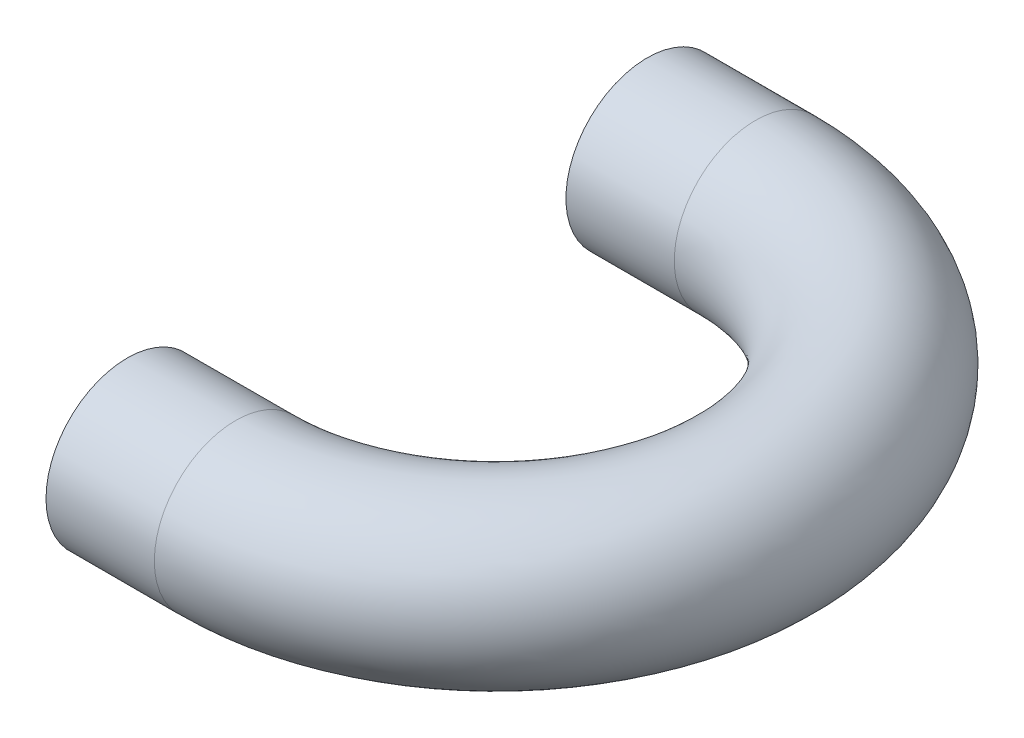
ISO-10303-21;
HEADER;
FILE_DESCRIPTION(('STEP AP214'),'2;1');
FILE_NAME('part.step','',(''),(''),'','','');
FILE_SCHEMA(('AUTOMOTIVE_DESIGN { 1 0 10303 214 1 1 1 1 }'));
ENDSEC;
DATA;
#1=APPLICATION_CONTEXT('core data for automotive mechanical design processes');
#2=APPLICATION_PROTOCOL_DEFINITION('international standard','automotive_design',2000,#1);
#3=PRODUCT_CONTEXT('',#1,'mechanical');
#4=PRODUCT('Part','Part','',(#3));
#5=PRODUCT_RELATED_PRODUCT_CATEGORY('part','',(#4));
#6=PRODUCT_DEFINITION_FORMATION('','',#4);
#7=PRODUCT_DEFINITION_CONTEXT('part definition',#1,'design');
#8=PRODUCT_DEFINITION('design','',#6,#7);
#9=PRODUCT_DEFINITION_SHAPE('','',#8);
#10=(LENGTH_UNIT() NAMED_UNIT(*) SI_UNIT(.MILLI.,.METRE.));
#11=(NAMED_UNIT(*) PLANE_ANGLE_UNIT() SI_UNIT($,.RADIAN.));
#12=(NAMED_UNIT(*) SI_UNIT($,.STERADIAN.) SOLID_ANGLE_UNIT());
#13=UNCERTAINTY_MEASURE_WITH_UNIT(LENGTH_MEASURE(1.E-05),#10,'distance_accuracy_value','');
#14=(GEOMETRIC_REPRESENTATION_CONTEXT(3) GLOBAL_UNCERTAINTY_ASSIGNED_CONTEXT((#13)) GLOBAL_UNIT_ASSIGNED_CONTEXT((#10,
#11,#12)) REPRESENTATION_CONTEXT('',''));
#15=CARTESIAN_POINT('',(0.,0.,0.));
#16=DIRECTION('',(0.,0.,1.));
#17=DIRECTION('',(1.,0.,0.));
#18=AXIS2_PLACEMENT_3D('',#15,#16,#17);
#19=CARTESIAN_POINT('',(0.,0.,0.));
#20=DIRECTION('',(1.,0.,0.));
#21=DIRECTION('',(0.,0.,-1.));
#22=AXIS2_PLACEMENT_3D('',#19,#20,#21);
#23=PLANE('',#22);
#24=CARTESIAN_POINT('',(0.,0.,0.));
#25=DIRECTION('',(1.,0.,0.));
#26=DIRECTION('',(0.,0.,-1.));
#27=AXIS2_PLACEMENT_3D('',#24,#25,#26);
#28=CIRCLE('',#27,4.7625);
#29=CARTESIAN_POINT('',(0.,0.,-4.7625));
#30=VERTEX_POINT('',#29);
#31=EDGE_CURVE('E35',#30,#30,#28,.T.);
#32=ORIENTED_EDGE('',*,*,#31,.F.);
#33=EDGE_LOOP('',(#32));
#34=FACE_BOUND('',#33,.T.);
#35=CARTESIAN_POINT('',(0.,0.,0.));
#36=DIRECTION('',(1.,0.,0.));
#37=DIRECTION('',(0.,0.,-1.));
#38=AXIS2_PLACEMENT_3D('',#35,#36,#37);
#39=CIRCLE('',#38,3.175);
#40=CARTESIAN_POINT('',(0.,0.,-3.175));
#41=VERTEX_POINT('',#40);
#42=EDGE_CURVE('E44',#41,#41,#39,.T.);
#43=ORIENTED_EDGE('',*,*,#42,.T.);
#44=EDGE_LOOP('',(#43));
#45=FACE_BOUND('',#44,.T.);
#46=ADVANCED_FACE('F31',(#34,#45),#23,.F.);
#47=CARTESIAN_POINT('',(6.35,0.,0.));
#48=DIRECTION('',(-1.,0.,0.));
#49=DIRECTION('',(0.,0.,1.));
#50=AXIS2_PLACEMENT_3D('',#47,#48,#49);
#51=CYLINDRICAL_SURFACE('',#50,4.7625);
#52=CARTESIAN_POINT('',(6.35,0.,0.));
#53=DIRECTION('',(1.,0.,0.));
#54=DIRECTION('',(0.,0.,-1.));
#55=AXIS2_PLACEMENT_3D('',#52,#53,#54);
#56=CIRCLE('',#55,4.7625);
#57=CARTESIAN_POINT('',(6.35,0.,4.7625));
#58=VERTEX_POINT('',#57);
#59=EDGE_CURVE('E10',#58,#58,#56,.T.);
#60=ORIENTED_EDGE('',*,*,#59,.F.);
#61=EDGE_LOOP('',(#60));
#62=FACE_BOUND('',#61,.T.);
#63=ORIENTED_EDGE('',*,*,#31,.T.);
#64=EDGE_LOOP('',(#63));
#65=FACE_BOUND('',#64,.T.);
#66=ADVANCED_FACE('F33',(#62,#65),#51,.T.);
#67=CARTESIAN_POINT('',(6.35,0.,0.));
#68=DIRECTION('',(-1.,0.,0.));
#69=DIRECTION('',(0.,0.,1.));
#70=AXIS2_PLACEMENT_3D('',#67,#68,#69);
#71=CYLINDRICAL_SURFACE('',#70,3.175);
#72=CARTESIAN_POINT('',(6.35,0.,0.));
#73=DIRECTION('',(1.,0.,0.));
#74=DIRECTION('',(0.,0.,-1.));
#75=AXIS2_PLACEMENT_3D('',#72,#73,#74);
#76=CIRCLE('',#75,3.175);
#77=CARTESIAN_POINT('',(6.35,0.,3.175));
#78=VERTEX_POINT('',#77);
#79=EDGE_CURVE('E42',#78,#78,#76,.T.);
#80=ORIENTED_EDGE('',*,*,#79,.T.);
#81=EDGE_LOOP('',(#80));
#82=FACE_BOUND('',#81,.T.);
#83=ORIENTED_EDGE('',*,*,#42,.F.);
#84=EDGE_LOOP('',(#83));
#85=FACE_BOUND('',#84,.T.);
#86=ADVANCED_FACE('F81',(#82,#85),#71,.F.);
#87=CARTESIAN_POINT('',(6.35,0.,-15.24));
#88=DIRECTION('',(0.,-1.,0.));
#89=DIRECTION('',(0.,0.,-1.));
#90=AXIS2_PLACEMENT_3D('',#87,#88,#89);
#91=TOROIDAL_SURFACE('',#90,15.24,3.175);
#92=CARTESIAN_POINT('',(6.34999999999989,0.,-30.48));
#93=DIRECTION('',(-1.,0.,0.));
#94=DIRECTION('',(0.,0.,1.));
#95=AXIS2_PLACEMENT_3D('',#92,#93,#94);
#96=CIRCLE('',#95,3.175);
#97=CARTESIAN_POINT('',(6.34999999999987,0.,-33.655));
#98=VERTEX_POINT('',#97);
#99=EDGE_CURVE('E52',#98,#98,#96,.T.);
#100=CARTESIAN_POINT('',(6.35,0.,-15.24));
#101=DIRECTION('',(0.,-1.,0.));
#102=DIRECTION('',(0.,0.,-1.));
#103=AXIS2_PLACEMENT_3D('',#100,#101,#102);
#104=CIRCLE('',#103,18.415);
#105=EDGE_CURVE('',#98,#78,#104,.T.);
#106=ORIENTED_EDGE('',*,*,#99,.T.);
#107=ORIENTED_EDGE('',*,*,#79,.F.);
#108=ORIENTED_EDGE('',*,*,#105,.T.);
#109=ORIENTED_EDGE('',*,*,#105,.F.);
#110=EDGE_LOOP('',(#106,#108,#107,#109));
#111=FACE_BOUND('',#110,.T.);
#112=ADVANCED_FACE('F88',(#111),#91,.F.);
#113=CARTESIAN_POINT('',(6.35,0.,-15.24));
#114=DIRECTION('',(0.,-1.,0.));
#115=DIRECTION('',(0.,0.,-1.));
#116=AXIS2_PLACEMENT_3D('',#113,#114,#115);
#117=TOROIDAL_SURFACE('',#116,15.24,4.7625);
#118=CARTESIAN_POINT('',(6.34999999999989,0.,-30.48));
#119=DIRECTION('',(-1.,0.,0.));
#120=DIRECTION('',(0.,0.,1.));
#121=AXIS2_PLACEMENT_3D('',#118,#119,#120);
#122=CIRCLE('',#121,4.7625);
#123=CARTESIAN_POINT('',(6.34999999999986,0.,-35.2425));
#124=VERTEX_POINT('',#123);
#125=EDGE_CURVE('E47',#124,#124,#122,.T.);
#126=CARTESIAN_POINT('',(6.35,0.,-15.24));
#127=DIRECTION('',(0.,-1.,0.));
#128=DIRECTION('',(0.,0.,-1.));
#129=AXIS2_PLACEMENT_3D('',#126,#127,#128);
#130=CIRCLE('',#129,20.0025);
#131=EDGE_CURVE('',#124,#58,#130,.T.);
#132=ORIENTED_EDGE('',*,*,#125,.F.);
#133=ORIENTED_EDGE('',*,*,#59,.T.);
#134=ORIENTED_EDGE('',*,*,#131,.T.);
#135=ORIENTED_EDGE('',*,*,#131,.F.);
#136=EDGE_LOOP('',(#132,#134,#133,#135));
#137=FACE_BOUND('',#136,.T.);
#138=ADVANCED_FACE('F90',(#137),#117,.T.);
#139=CARTESIAN_POINT('',(0.,0.,-30.48));
#140=DIRECTION('',(1.,0.,0.));
#141=DIRECTION('',(0.,0.,-1.));
#142=AXIS2_PLACEMENT_3D('',#139,#140,#141);
#143=PLANE('',#142);
#144=CARTESIAN_POINT('',(0.,0.,-30.48));
#145=DIRECTION('',(1.,0.,0.));
#146=DIRECTION('',(0.,0.,-1.));
#147=AXIS2_PLACEMENT_3D('',#144,#145,#146);
#148=CIRCLE('',#147,4.7625);
#149=CARTESIAN_POINT('',(0.,0.,-35.2425));
#150=VERTEX_POINT('',#149);
#151=EDGE_CURVE('E55',#150,#150,#148,.T.);
#152=ORIENTED_EDGE('',*,*,#151,.F.);
#153=EDGE_LOOP('',(#152));
#154=FACE_BOUND('',#153,.T.);
#155=CARTESIAN_POINT('',(0.,0.,-30.48));
#156=DIRECTION('',(1.,0.,0.));
#157=DIRECTION('',(0.,0.,-1.));
#158=AXIS2_PLACEMENT_3D('',#155,#156,#157);
#159=CIRCLE('',#158,3.175);
#160=CARTESIAN_POINT('',(0.,0.,-33.655));
#161=VERTEX_POINT('',#160);
#162=EDGE_CURVE('E58',#161,#161,#159,.T.);
#163=ORIENTED_EDGE('',*,*,#162,.T.);
#164=EDGE_LOOP('',(#163));
#165=FACE_BOUND('',#164,.T.);
#166=ADVANCED_FACE('F62',(#154,#165),#143,.F.);
#167=CARTESIAN_POINT('',(6.35,0.,-30.48));
#168=DIRECTION('',(-1.,0.,0.));
#169=DIRECTION('',(0.,0.,1.));
#170=AXIS2_PLACEMENT_3D('',#167,#168,#169);
#171=CYLINDRICAL_SURFACE('',#170,4.7625);
#172=ORIENTED_EDGE('',*,*,#125,.T.);
#173=EDGE_LOOP('',(#172));
#174=FACE_BOUND('',#173,.T.);
#175=ORIENTED_EDGE('',*,*,#151,.T.);
#176=EDGE_LOOP('',(#175));
#177=FACE_BOUND('',#176,.T.);
#178=ADVANCED_FACE('F66',(#174,#177),#171,.T.);
#179=CARTESIAN_POINT('',(6.35,0.,-30.48));
#180=DIRECTION('',(-1.,0.,0.));
#181=DIRECTION('',(0.,0.,1.));
#182=AXIS2_PLACEMENT_3D('',#179,#180,#181);
#183=CYLINDRICAL_SURFACE('',#182,3.175);
#184=ORIENTED_EDGE('',*,*,#99,.F.);
#185=EDGE_LOOP('',(#184));
#186=FACE_BOUND('',#185,.T.);
#187=ORIENTED_EDGE('',*,*,#162,.F.);
#188=EDGE_LOOP('',(#187));
#189=FACE_BOUND('',#188,.T.);
#190=ADVANCED_FACE('F64',(#186,#189),#183,.F.);
#191=CLOSED_SHELL('',(#46,#66,#86,#112,#138,#166,#178,#190));
#192=MANIFOLD_SOLID_BREP('B2',#191);
#193=ADVANCED_BREP_SHAPE_REPRESENTATION('',(#18,#192),#14);
#194=SHAPE_DEFINITION_REPRESENTATION(#9,#193);
ENDSEC;
END-ISO-10303-21;
